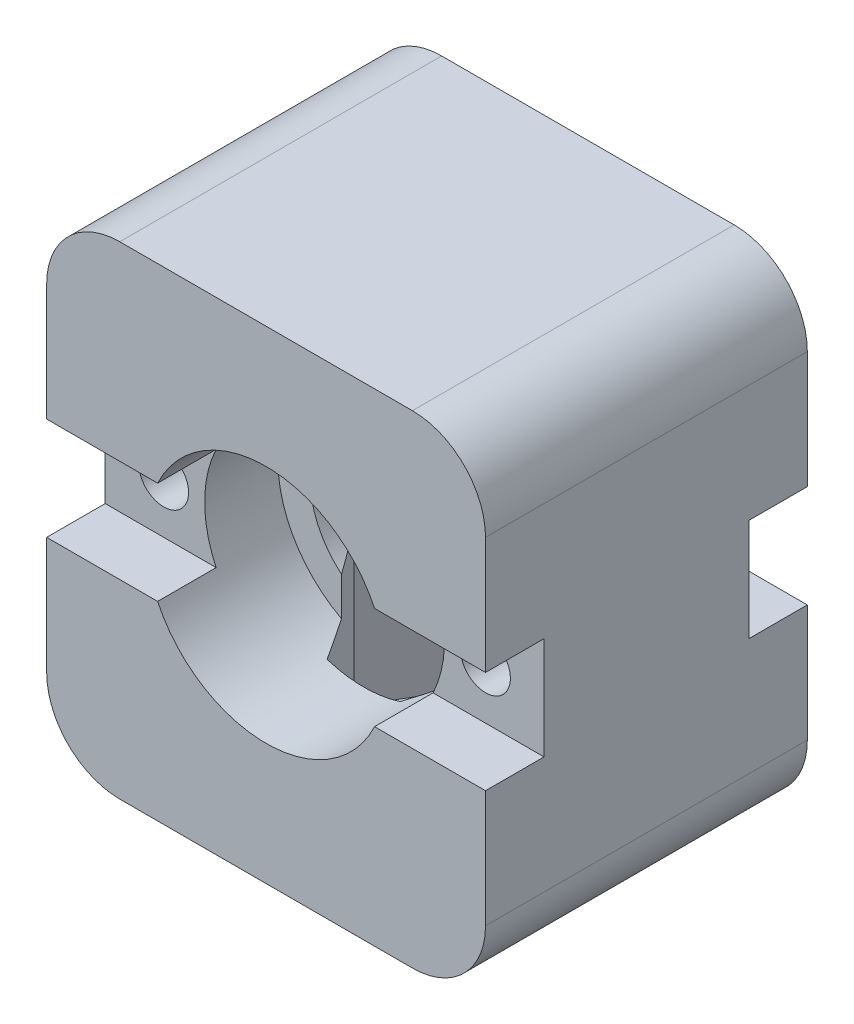
ISO-10303-21;
HEADER;
FILE_DESCRIPTION(('STEP AP214'),'2;1');
FILE_NAME('part.step','',(''),(''),'','','');
FILE_SCHEMA(('AUTOMOTIVE_DESIGN { 1 0 10303 214 1 1 1 1 }'));
ENDSEC;
DATA;
#1=APPLICATION_CONTEXT('core data for automotive mechanical design processes');
#2=APPLICATION_PROTOCOL_DEFINITION('international standard','automotive_design',2000,#1);
#3=PRODUCT_CONTEXT('',#1,'mechanical');
#4=PRODUCT('Part','Part','',(#3));
#5=PRODUCT_RELATED_PRODUCT_CATEGORY('part','',(#4));
#6=PRODUCT_DEFINITION_FORMATION('','',#4);
#7=PRODUCT_DEFINITION_CONTEXT('part definition',#1,'design');
#8=PRODUCT_DEFINITION('design','',#6,#7);
#9=PRODUCT_DEFINITION_SHAPE('','',#8);
#10=(LENGTH_UNIT() NAMED_UNIT(*) SI_UNIT(.MILLI.,.METRE.));
#11=(NAMED_UNIT(*) PLANE_ANGLE_UNIT() SI_UNIT($,.RADIAN.));
#12=(NAMED_UNIT(*) SI_UNIT($,.STERADIAN.) SOLID_ANGLE_UNIT());
#13=UNCERTAINTY_MEASURE_WITH_UNIT(LENGTH_MEASURE(1.E-05),#10,'distance_accuracy_value','');
#14=(GEOMETRIC_REPRESENTATION_CONTEXT(3) GLOBAL_UNCERTAINTY_ASSIGNED_CONTEXT((#13)) GLOBAL_UNIT_ASSIGNED_CONTEXT((#10,
#11,#12)) REPRESENTATION_CONTEXT('',''));
#15=CARTESIAN_POINT('',(0.,0.,0.));
#16=DIRECTION('',(0.,0.,1.));
#17=DIRECTION('',(1.,0.,0.));
#18=AXIS2_PLACEMENT_3D('',#15,#16,#17);
#19=CARTESIAN_POINT('',(11.,0.,22.));
#20=DIRECTION('',(0.,0.,-1.));
#21=DIRECTION('',(-1.,0.,0.));
#22=AXIS2_PLACEMENT_3D('',#19,#20,#21);
#23=CYLINDRICAL_SURFACE('',#22,1.7);
#24=CARTESIAN_POINT('',(11.,0.,7.));
#25=DIRECTION('',(0.,0.,1.));
#26=DIRECTION('',(1.,0.,0.));
#27=AXIS2_PLACEMENT_3D('',#24,#25,#26);
#28=CIRCLE('',#27,1.7);
#29=CARTESIAN_POINT('',(12.7,0.,7.));
#30=VERTEX_POINT('',#29);
#31=EDGE_CURVE('E571',#30,#30,#28,.F.);
#32=ORIENTED_EDGE('',*,*,#31,.F.);
#33=EDGE_LOOP('',(#32));
#34=FACE_BOUND('',#33,.T.);
#35=CARTESIAN_POINT('',(11.,0.,-7.));
#36=DIRECTION('',(0.,0.,-1.));
#37=DIRECTION('',(-1.,0.,0.));
#38=AXIS2_PLACEMENT_3D('',#35,#36,#37);
#39=CIRCLE('',#38,1.7);
#40=CARTESIAN_POINT('',(9.3,0.,-7.));
#41=VERTEX_POINT('',#40);
#42=EDGE_CURVE('E287',#41,#41,#39,.F.);
#43=ORIENTED_EDGE('',*,*,#42,.F.);
#44=EDGE_LOOP('',(#43));
#45=FACE_BOUND('',#44,.T.);
#46=ADVANCED_FACE('F40',(#34,#45),#23,.F.);
#47=CARTESIAN_POINT('',(-11.,0.,22.));
#48=DIRECTION('',(0.,0.,-1.));
#49=DIRECTION('',(-1.,0.,0.));
#50=AXIS2_PLACEMENT_3D('',#47,#48,#49);
#51=CYLINDRICAL_SURFACE('',#50,1.7);
#52=CARTESIAN_POINT('',(-11.,0.,7.));
#53=DIRECTION('',(0.,0.,1.));
#54=DIRECTION('',(1.,0.,0.));
#55=AXIS2_PLACEMENT_3D('',#52,#53,#54);
#56=CIRCLE('',#55,1.7);
#57=CARTESIAN_POINT('',(-9.3,0.,7.));
#58=VERTEX_POINT('',#57);
#59=EDGE_CURVE('E567',#58,#58,#56,.F.);
#60=ORIENTED_EDGE('',*,*,#59,.F.);
#61=EDGE_LOOP('',(#60));
#62=FACE_BOUND('',#61,.T.);
#63=CARTESIAN_POINT('',(-11.,0.,-7.));
#64=DIRECTION('',(0.,0.,-1.));
#65=DIRECTION('',(-1.,0.,0.));
#66=AXIS2_PLACEMENT_3D('',#63,#64,#65);
#67=CIRCLE('',#66,1.7);
#68=CARTESIAN_POINT('',(-12.7,0.,-7.));
#69=VERTEX_POINT('',#68);
#70=EDGE_CURVE('E448',#69,#69,#67,.F.);
#71=ORIENTED_EDGE('',*,*,#70,.F.);
#72=EDGE_LOOP('',(#71));
#73=FACE_BOUND('',#72,.T.);
#74=ADVANCED_FACE('F848',(#62,#73),#51,.F.);
#75=CARTESIAN_POINT('',(-15.,-11.5,-11.));
#76=DIRECTION('',(-1.,0.,0.));
#77=DIRECTION('',(0.,0.,1.));
#78=AXIS2_PLACEMENT_3D('',#75,#76,#77);
#79=PLANE('',#78);
#80=DIRECTION('',(0.,-1.,0.));
#81=VECTOR('',#80,1.);
#82=CARTESIAN_POINT('',(-15.,-11.5,-7.));
#83=LINE('',#82,#81);
#84=CARTESIAN_POINT('',(-15.,3.5,-7.));
#85=VERTEX_POINT('',#84);
#86=CARTESIAN_POINT('',(-15.,-3.5,-7.));
#87=VERTEX_POINT('',#86);
#88=EDGE_CURVE('E444',#85,#87,#83,.T.);
#89=ORIENTED_EDGE('',*,*,#88,.T.);
#90=DIRECTION('',(0.,0.,-1.));
#91=VECTOR('',#90,1.);
#92=CARTESIAN_POINT('',(-15.,-3.5,-11.));
#93=LINE('',#92,#91);
#94=CARTESIAN_POINT('',(-15.,-3.5,-11.));
#95=VERTEX_POINT('',#94);
#96=EDGE_CURVE('E461',#87,#95,#93,.T.);
#97=ORIENTED_EDGE('',*,*,#96,.T.);
#98=DIRECTION('',(0.,-1.,0.));
#99=VECTOR('',#98,1.);
#100=CARTESIAN_POINT('',(-15.,1.5,-11.));
#101=LINE('',#100,#99);
#102=CARTESIAN_POINT('',(-15.,-11.5,-11.));
#103=VERTEX_POINT('',#102);
#104=EDGE_CURVE('E317',#95,#103,#101,.T.);
#105=ORIENTED_EDGE('',*,*,#104,.T.);
#106=DIRECTION('',(0.,0.,1.));
#107=VECTOR('',#106,1.);
#108=CARTESIAN_POINT('',(-15.,-11.5,-11.));
#109=LINE('',#108,#107);
#110=CARTESIAN_POINT('',(-15.,-11.5,11.));
#111=VERTEX_POINT('',#110);
#112=EDGE_CURVE('E323',#103,#111,#109,.T.);
#113=ORIENTED_EDGE('',*,*,#112,.T.);
#114=DIRECTION('',(0.,-1.,0.));
#115=VECTOR('',#114,1.);
#116=CARTESIAN_POINT('',(-15.,1.5,11.));
#117=LINE('',#116,#115);
#118=CARTESIAN_POINT('',(-15.,-3.5,11.));
#119=VERTEX_POINT('',#118);
#120=EDGE_CURVE('E631',#119,#111,#117,.T.);
#121=ORIENTED_EDGE('',*,*,#120,.F.);
#122=DIRECTION('',(0.,0.,1.));
#123=VECTOR('',#122,1.);
#124=CARTESIAN_POINT('',(-15.,-3.5,-11.));
#125=LINE('',#124,#123);
#126=CARTESIAN_POINT('',(-15.,-3.5,7.));
#127=VERTEX_POINT('',#126);
#128=EDGE_CURVE('E586',#127,#119,#125,.T.);
#129=ORIENTED_EDGE('',*,*,#128,.F.);
#130=DIRECTION('',(0.,1.,0.));
#131=VECTOR('',#130,1.);
#132=CARTESIAN_POINT('',(-15.,-11.5,7.));
#133=LINE('',#132,#131);
#134=CARTESIAN_POINT('',(-15.,3.5,7.));
#135=VERTEX_POINT('',#134);
#136=EDGE_CURVE('E579',#127,#135,#133,.T.);
#137=ORIENTED_EDGE('',*,*,#136,.T.);
#138=DIRECTION('',(0.,0.,-1.));
#139=VECTOR('',#138,1.);
#140=CARTESIAN_POINT('',(-15.,3.5,-11.));
#141=LINE('',#140,#139);
#142=CARTESIAN_POINT('',(-15.,3.5,11.));
#143=VERTEX_POINT('',#142);
#144=EDGE_CURVE('E592',#143,#135,#141,.T.);
#145=ORIENTED_EDGE('',*,*,#144,.F.);
#146=CARTESIAN_POINT('',(-15.,11.5,11.));
#147=VERTEX_POINT('',#146);
#148=EDGE_CURVE('E632',#147,#143,#117,.T.);
#149=ORIENTED_EDGE('',*,*,#148,.F.);
#150=DIRECTION('',(0.,0.,1.));
#151=VECTOR('',#150,1.);
#152=CARTESIAN_POINT('',(-15.,11.5,-11.));
#153=LINE('',#152,#151);
#154=CARTESIAN_POINT('',(-15.,11.5,-11.));
#155=VERTEX_POINT('',#154);
#156=EDGE_CURVE('E328',#155,#147,#153,.T.);
#157=ORIENTED_EDGE('',*,*,#156,.F.);
#158=CARTESIAN_POINT('',(-15.,3.5,-11.));
#159=VERTEX_POINT('',#158);
#160=EDGE_CURVE('E318',#155,#159,#101,.T.);
#161=ORIENTED_EDGE('',*,*,#160,.T.);
#162=DIRECTION('',(0.,0.,1.));
#163=VECTOR('',#162,1.);
#164=CARTESIAN_POINT('',(-15.,3.5,-11.));
#165=LINE('',#164,#163);
#166=EDGE_CURVE('E286',#159,#85,#165,.T.);
#167=ORIENTED_EDGE('',*,*,#166,.T.);
#168=EDGE_LOOP('',(#89,#97,#105,#113,#121,#129,#137,#145,#149,#157,#161,#167));
#169=FACE_BOUND('',#168,.T.);
#170=ADVANCED_FACE('F657',(#169),#79,.T.);
#171=CARTESIAN_POINT('',(15.,1.50000000000001,-11.));
#172=DIRECTION('',(1.,0.,0.));
#173=DIRECTION('',(0.,1.,0.));
#174=AXIS2_PLACEMENT_3D('',#171,#172,#173);
#175=PLANE('',#174);
#176=DIRECTION('',(0.,1.,0.));
#177=VECTOR('',#176,1.);
#178=CARTESIAN_POINT('',(15.,-11.5,-11.));
#179=LINE('',#178,#177);
#180=CARTESIAN_POINT('',(15.,-11.5,-11.));
#181=VERTEX_POINT('',#180);
#182=CARTESIAN_POINT('',(15.,-3.5,-11.));
#183=VERTEX_POINT('',#182);
#184=EDGE_CURVE('E296',#181,#183,#179,.T.);
#185=ORIENTED_EDGE('',*,*,#184,.T.);
#186=DIRECTION('',(0.,0.,1.));
#187=VECTOR('',#186,1.);
#188=CARTESIAN_POINT('',(15.,-3.5,-11.));
#189=LINE('',#188,#187);
#190=CARTESIAN_POINT('',(15.,-3.5,-7.));
#191=VERTEX_POINT('',#190);
#192=EDGE_CURVE('E458',#183,#191,#189,.T.);
#193=ORIENTED_EDGE('',*,*,#192,.T.);
#194=DIRECTION('',(0.,1.,0.));
#195=VECTOR('',#194,1.);
#196=CARTESIAN_POINT('',(15.,1.50000000000001,-7.));
#197=LINE('',#196,#195);
#198=CARTESIAN_POINT('',(15.,3.5,-7.));
#199=VERTEX_POINT('',#198);
#200=EDGE_CURVE('E284',#191,#199,#197,.T.);
#201=ORIENTED_EDGE('',*,*,#200,.T.);
#202=DIRECTION('',(0.,0.,-1.));
#203=VECTOR('',#202,1.);
#204=CARTESIAN_POINT('',(15.,3.5,-11.));
#205=LINE('',#204,#203);
#206=CARTESIAN_POINT('',(15.,3.5,-11.));
#207=VERTEX_POINT('',#206);
#208=EDGE_CURVE('E265',#199,#207,#205,.T.);
#209=ORIENTED_EDGE('',*,*,#208,.T.);
#210=CARTESIAN_POINT('',(15.,11.5,-11.));
#211=VERTEX_POINT('',#210);
#212=EDGE_CURVE('E281',#207,#211,#179,.T.);
#213=ORIENTED_EDGE('',*,*,#212,.T.);
#214=DIRECTION('',(0.,0.,1.));
#215=VECTOR('',#214,1.);
#216=CARTESIAN_POINT('',(15.,11.5,-11.));
#217=LINE('',#216,#215);
#218=CARTESIAN_POINT('',(15.,11.5,11.));
#219=VERTEX_POINT('',#218);
#220=EDGE_CURVE('E337',#211,#219,#217,.T.);
#221=ORIENTED_EDGE('',*,*,#220,.T.);
#222=DIRECTION('',(0.,1.,0.));
#223=VECTOR('',#222,1.);
#224=CARTESIAN_POINT('',(15.,-11.5,11.));
#225=LINE('',#224,#223);
#226=CARTESIAN_POINT('',(15.,3.5,11.));
#227=VERTEX_POINT('',#226);
#228=EDGE_CURVE('E614',#227,#219,#225,.T.);
#229=ORIENTED_EDGE('',*,*,#228,.F.);
#230=DIRECTION('',(0.,0.,1.));
#231=VECTOR('',#230,1.);
#232=CARTESIAN_POINT('',(15.,3.5,-11.));
#233=LINE('',#232,#231);
#234=CARTESIAN_POINT('',(15.,3.5,7.));
#235=VERTEX_POINT('',#234);
#236=EDGE_CURVE('E589',#235,#227,#233,.T.);
#237=ORIENTED_EDGE('',*,*,#236,.F.);
#238=DIRECTION('',(0.,-1.,0.));
#239=VECTOR('',#238,1.);
#240=CARTESIAN_POINT('',(15.,1.50000000000001,7.));
#241=LINE('',#240,#239);
#242=CARTESIAN_POINT('',(15.,-3.5,7.));
#243=VERTEX_POINT('',#242);
#244=EDGE_CURVE('E575',#235,#243,#241,.T.);
#245=ORIENTED_EDGE('',*,*,#244,.T.);
#246=DIRECTION('',(0.,0.,-1.));
#247=VECTOR('',#246,1.);
#248=CARTESIAN_POINT('',(15.,-3.5,-11.));
#249=LINE('',#248,#247);
#250=CARTESIAN_POINT('',(15.,-3.5,11.));
#251=VERTEX_POINT('',#250);
#252=EDGE_CURVE('E583',#251,#243,#249,.T.);
#253=ORIENTED_EDGE('',*,*,#252,.F.);
#254=CARTESIAN_POINT('',(15.,-11.5,11.));
#255=VERTEX_POINT('',#254);
#256=EDGE_CURVE('E615',#255,#251,#225,.T.);
#257=ORIENTED_EDGE('',*,*,#256,.F.);
#258=DIRECTION('',(0.,0.,1.));
#259=VECTOR('',#258,1.);
#260=CARTESIAN_POINT('',(15.,-11.5,-11.));
#261=LINE('',#260,#259);
#262=EDGE_CURVE('E340',#181,#255,#261,.T.);
#263=ORIENTED_EDGE('',*,*,#262,.F.);
#264=EDGE_LOOP('',(#185,#193,#201,#209,#213,#221,#229,#237,#245,#253,#257,#263));
#265=FACE_BOUND('',#264,.T.);
#266=ADVANCED_FACE('F279',(#265),#175,.T.);
#267=CARTESIAN_POINT('',(-10.,-11.5,-11.));
#268=DIRECTION('',(0.,0.,1.));
#269=DIRECTION('',(1.,0.,0.));
#270=AXIS2_PLACEMENT_3D('',#267,#268,#269);
#271=PLANE('',#270);
#272=DIRECTION('',(1.,0.,0.));
#273=VECTOR('',#272,1.);
#274=CARTESIAN_POINT('',(15.3,-3.5,-11.));
#275=LINE('',#274,#273);
#276=CARTESIAN_POINT('',(7.41552425658496,-3.5,-11.));
#277=VERTEX_POINT('',#276);
#278=EDGE_CURVE('E273',#277,#183,#275,.T.);
#279=ORIENTED_EDGE('',*,*,#278,.T.);
#280=ORIENTED_EDGE('',*,*,#184,.F.);
#281=CARTESIAN_POINT('',(10.,-11.5,-11.));
#282=DIRECTION('',(0.,0.,1.));
#283=DIRECTION('',(1.,0.,0.));
#284=AXIS2_PLACEMENT_3D('',#281,#282,#283);
#285=CIRCLE('',#284,5.);
#286=CARTESIAN_POINT('',(9.99999999999996,-16.5,-11.));
#287=VERTEX_POINT('',#286);
#288=EDGE_CURVE('E297',#287,#181,#285,.T.);
#289=ORIENTED_EDGE('',*,*,#288,.F.);
#290=DIRECTION('',(1.,0.,0.));
#291=VECTOR('',#290,1.);
#292=CARTESIAN_POINT('',(9.99999999999996,-16.5,-11.));
#293=LINE('',#292,#291);
#294=CARTESIAN_POINT('',(-9.99999999999996,-16.5,-11.));
#295=VERTEX_POINT('',#294);
#296=EDGE_CURVE('E303',#295,#287,#293,.T.);
#297=ORIENTED_EDGE('',*,*,#296,.F.);
#298=CARTESIAN_POINT('',(-10.,-11.5,-11.));
#299=DIRECTION('',(0.,0.,1.));
#300=DIRECTION('',(1.,0.,0.));
#301=AXIS2_PLACEMENT_3D('',#298,#299,#300);
#302=CIRCLE('',#301,5.);
#303=EDGE_CURVE('E636',#103,#295,#302,.T.);
#304=ORIENTED_EDGE('',*,*,#303,.F.);
#305=ORIENTED_EDGE('',*,*,#104,.F.);
#306=CARTESIAN_POINT('',(-7.41552425658496,-3.5,-11.));
#307=VERTEX_POINT('',#306);
#308=EDGE_CURVE('E436',#95,#307,#275,.T.);
#309=ORIENTED_EDGE('',*,*,#308,.T.);
#310=CARTESIAN_POINT('',(0.,0.,-11.));
#311=DIRECTION('',(0.,0.,1.));
#312=DIRECTION('',(1.,0.,0.));
#313=AXIS2_PLACEMENT_3D('',#310,#311,#312);
#314=CIRCLE('',#313,8.2);
#315=EDGE_CURVE('E465',#307,#277,#314,.T.);
#316=ORIENTED_EDGE('',*,*,#315,.T.);
#317=EDGE_LOOP('',(#279,#280,#289,#297,#304,#305,#309,#316));
#318=FACE_BOUND('',#317,.T.);
#319=ADVANCED_FACE('F649',(#318),#271,.F.);
#320=DIRECTION('',(-1.,0.,0.));
#321=VECTOR('',#320,1.);
#322=CARTESIAN_POINT('',(15.3,3.5,-11.));
#323=LINE('',#322,#321);
#324=CARTESIAN_POINT('',(-7.41552425658496,3.5,-11.));
#325=VERTEX_POINT('',#324);
#326=EDGE_CURVE('E274',#325,#159,#323,.T.);
#327=ORIENTED_EDGE('',*,*,#326,.T.);
#328=ORIENTED_EDGE('',*,*,#160,.F.);
#329=CARTESIAN_POINT('',(-10.,11.5,-11.));
#330=DIRECTION('',(0.,0.,1.));
#331=DIRECTION('',(-1.,0.,0.));
#332=AXIS2_PLACEMENT_3D('',#329,#330,#331);
#333=CIRCLE('',#332,5.);
#334=CARTESIAN_POINT('',(-9.99999999999996,16.5,-11.));
#335=VERTEX_POINT('',#334);
#336=EDGE_CURVE('E313',#335,#155,#333,.T.);
#337=ORIENTED_EDGE('',*,*,#336,.F.);
#338=DIRECTION('',(-1.,0.,0.));
#339=VECTOR('',#338,1.);
#340=CARTESIAN_POINT('',(9.99999999999996,16.5,-11.));
#341=LINE('',#340,#339);
#342=CARTESIAN_POINT('',(9.99999999999996,16.5,-11.));
#343=VERTEX_POINT('',#342);
#344=EDGE_CURVE('E309',#343,#335,#341,.T.);
#345=ORIENTED_EDGE('',*,*,#344,.F.);
#346=CARTESIAN_POINT('',(10.,11.5,-11.));
#347=DIRECTION('',(0.,0.,1.));
#348=DIRECTION('',(1.,0.,0.));
#349=AXIS2_PLACEMENT_3D('',#346,#347,#348);
#350=CIRCLE('',#349,5.);
#351=EDGE_CURVE('E294',#211,#343,#350,.T.);
#352=ORIENTED_EDGE('',*,*,#351,.F.);
#353=ORIENTED_EDGE('',*,*,#212,.F.);
#354=CARTESIAN_POINT('',(7.41552425658496,3.5,-11.));
#355=VERTEX_POINT('',#354);
#356=EDGE_CURVE('E261',#207,#355,#323,.T.);
#357=ORIENTED_EDGE('',*,*,#356,.T.);
#358=EDGE_CURVE('E471',#355,#325,#314,.T.);
#359=ORIENTED_EDGE('',*,*,#358,.T.);
#360=EDGE_LOOP('',(#327,#328,#337,#345,#352,#353,#357,#359));
#361=FACE_BOUND('',#360,.T.);
#362=ADVANCED_FACE('F291',(#361),#271,.F.);
#363=CARTESIAN_POINT('',(0.,0.,-2.));
#364=DIRECTION('',(0.,0.,-1.));
#365=DIRECTION('',(-1.,0.,0.));
#366=AXIS2_PLACEMENT_3D('',#363,#364,#365);
#367=CYLINDRICAL_SURFACE('',#366,8.2);
#368=CARTESIAN_POINT('',(0.,0.,-8.66025403784439));
#369=DIRECTION('',(-0.866025403784439,0.,-0.5));
#370=DIRECTION('',(0.5,0.,-0.866025403784439));
#371=AXIS2_PLACEMENT_3D('',#368,#369,#370);
#372=ELLIPSE('',#371,16.4,8.2);
#373=CARTESIAN_POINT('',(-3.84529946162075,-7.24249073526913,-2.));
#374=VERTEX_POINT('',#373);
#375=CARTESIAN_POINT('',(-2.5,-7.80960946526777,-4.3301270189222));
#376=VERTEX_POINT('',#375);
#377=EDGE_CURVE('E482',#374,#376,#372,.F.);
#378=ORIENTED_EDGE('',*,*,#377,.T.);
#379=CARTESIAN_POINT('',(0.,0.,-4.3301270189222));
#380=DIRECTION('',(0.,0.,-1.));
#381=DIRECTION('',(-1.,0.,0.));
#382=AXIS2_PLACEMENT_3D('',#379,#380,#381);
#383=CIRCLE('',#382,8.2);
#384=CARTESIAN_POINT('',(2.5,-7.80960946526778,-4.3301270189222));
#385=VERTEX_POINT('',#384);
#386=EDGE_CURVE('E479',#376,#385,#383,.F.);
#387=ORIENTED_EDGE('',*,*,#386,.T.);
#388=CARTESIAN_POINT('',(0.,0.,-8.66025403784439));
#389=DIRECTION('',(0.866025403784439,0.,-0.5));
#390=DIRECTION('',(-0.5,0.,-0.866025403784439));
#391=AXIS2_PLACEMENT_3D('',#388,#389,#390);
#392=ELLIPSE('',#391,16.4,8.2);
#393=CARTESIAN_POINT('',(3.84529946162075,-7.24249073526913,-2.));
#394=VERTEX_POINT('',#393);
#395=EDGE_CURVE('E401',#385,#394,#392,.F.);
#396=ORIENTED_EDGE('',*,*,#395,.T.);
#397=CARTESIAN_POINT('',(0.,0.,-2.));
#398=DIRECTION('',(0.,0.,1.));
#399=DIRECTION('',(1.,0.,0.));
#400=AXIS2_PLACEMENT_3D('',#397,#398,#399);
#401=CIRCLE('',#400,8.2);
#402=EDGE_CURVE('E466',#394,#374,#401,.T.);
#403=ORIENTED_EDGE('',*,*,#402,.T.);
#404=EDGE_LOOP('',(#378,#387,#396,#403));
#405=FACE_BOUND('',#404,.T.);
#406=CARTESIAN_POINT('',(0.,0.,-7.));
#407=DIRECTION('',(0.,0.,-1.));
#408=DIRECTION('',(-1.,0.,0.));
#409=AXIS2_PLACEMENT_3D('',#406,#407,#408);
#410=CIRCLE('',#409,8.2);
#411=CARTESIAN_POINT('',(7.41552425658496,3.5,-7.));
#412=VERTEX_POINT('',#411);
#413=CARTESIAN_POINT('',(7.41552425658496,-3.5,-7.));
#414=VERTEX_POINT('',#413);
#415=EDGE_CURVE('E410',#412,#414,#410,.T.);
#416=ORIENTED_EDGE('',*,*,#415,.T.);
#417=DIRECTION('',(0.,0.,-1.));
#418=VECTOR('',#417,1.);
#419=CARTESIAN_POINT('',(7.41552425658496,-3.5,-2.));
#420=LINE('',#419,#418);
#421=EDGE_CURVE('E11',#414,#277,#420,.T.);
#422=ORIENTED_EDGE('',*,*,#421,.T.);
#423=ORIENTED_EDGE('',*,*,#315,.F.);
#424=DIRECTION('',(0.,0.,-1.));
#425=VECTOR('',#424,1.);
#426=CARTESIAN_POINT('',(-7.41552425658496,-3.5,-2.));
#427=LINE('',#426,#425);
#428=CARTESIAN_POINT('',(-7.41552425658496,-3.5,-7.));
#429=VERTEX_POINT('',#428);
#430=EDGE_CURVE('E414',#307,#429,#427,.F.);
#431=ORIENTED_EDGE('',*,*,#430,.T.);
#432=CARTESIAN_POINT('',(-7.41552425658496,3.5,-7.));
#433=VERTEX_POINT('',#432);
#434=EDGE_CURVE('E405',#429,#433,#410,.T.);
#435=ORIENTED_EDGE('',*,*,#434,.T.);
#436=DIRECTION('',(0.,0.,-1.));
#437=VECTOR('',#436,1.);
#438=CARTESIAN_POINT('',(-7.41552425658496,3.5,-2.));
#439=LINE('',#438,#437);
#440=EDGE_CURVE('E409',#433,#325,#439,.T.);
#441=ORIENTED_EDGE('',*,*,#440,.T.);
#442=ORIENTED_EDGE('',*,*,#358,.F.);
#443=DIRECTION('',(0.,0.,-1.));
#444=VECTOR('',#443,1.);
#445=CARTESIAN_POINT('',(7.41552425658496,3.5,-2.));
#446=LINE('',#445,#444);
#447=EDGE_CURVE('E49',#355,#412,#446,.F.);
#448=ORIENTED_EDGE('',*,*,#447,.T.);
#449=EDGE_LOOP('',(#416,#422,#423,#431,#435,#441,#442,#448));
#450=FACE_BOUND('',#449,.T.);
#451=ADVANCED_FACE('F423',(#405,#450),#367,.F.);
#452=CARTESIAN_POINT('',(0.,0.,22.));
#453=DIRECTION('',(0.,0.,-1.));
#454=DIRECTION('',(-1.,0.,0.));
#455=AXIS2_PLACEMENT_3D('',#452,#453,#454);
#456=CYLINDRICAL_SURFACE('',#455,6.);
#457=CARTESIAN_POINT('',(0.,0.,-2.));
#458=DIRECTION('',(0.,0.,-1.));
#459=DIRECTION('',(-1.,0.,0.));
#460=AXIS2_PLACEMENT_3D('',#457,#458,#459);
#461=CIRCLE('',#460,6.);
#462=CARTESIAN_POINT('',(3.84529946162075,-4.60583022379888,-2.));
#463=VERTEX_POINT('',#462);
#464=CARTESIAN_POINT('',(-3.84529946162075,-4.60583022379887,-2.));
#465=VERTEX_POINT('',#464);
#466=EDGE_CURVE('E470',#463,#465,#461,.F.);
#467=ORIENTED_EDGE('',*,*,#466,.F.);
#468=CARTESIAN_POINT('',(0.,0.,-8.66025403784438));
#469=DIRECTION('',(0.866025403784439,0.,-0.5));
#470=DIRECTION('',(-0.5,0.,-0.866025403784439));
#471=AXIS2_PLACEMENT_3D('',#468,#469,#470);
#472=ELLIPSE('',#471,12.,6.);
#473=CARTESIAN_POINT('',(5.,-3.31662479035541,0.));
#474=VERTEX_POINT('',#473);
#475=EDGE_CURVE('E385',#463,#474,#472,.F.);
#476=ORIENTED_EDGE('',*,*,#475,.T.);
#477=CARTESIAN_POINT('',(0.,0.,8.66025403784439));
#478=DIRECTION('',(0.866025403784439,0.,0.5));
#479=DIRECTION('',(0.5,0.,-0.866025403784439));
#480=AXIS2_PLACEMENT_3D('',#477,#478,#479);
#481=ELLIPSE('',#480,12.,6.);
#482=CARTESIAN_POINT('',(3.84529946162075,-4.60583022379887,2.));
#483=VERTEX_POINT('',#482);
#484=EDGE_CURVE('E545',#474,#483,#481,.F.);
#485=ORIENTED_EDGE('',*,*,#484,.T.);
#486=CARTESIAN_POINT('',(0.,0.,2.));
#487=DIRECTION('',(0.,0.,1.));
#488=DIRECTION('',(1.,0.,0.));
#489=AXIS2_PLACEMENT_3D('',#486,#487,#488);
#490=CIRCLE('',#489,6.);
#491=CARTESIAN_POINT('',(-3.84529946162075,-4.60583022379887,2.));
#492=VERTEX_POINT('',#491);
#493=EDGE_CURVE('E348',#492,#483,#490,.F.);
#494=ORIENTED_EDGE('',*,*,#493,.F.);
#495=CARTESIAN_POINT('',(0.,0.,8.6602540378444));
#496=DIRECTION('',(-0.866025403784439,0.,0.5));
#497=DIRECTION('',(-0.5,0.,-0.866025403784439));
#498=AXIS2_PLACEMENT_3D('',#495,#496,#497);
#499=ELLIPSE('',#498,12.,6.);
#500=CARTESIAN_POINT('',(-5.,-3.31662479035539,0.));
#501=VERTEX_POINT('',#500);
#502=EDGE_CURVE('E538',#492,#501,#499,.F.);
#503=ORIENTED_EDGE('',*,*,#502,.T.);
#504=CARTESIAN_POINT('',(0.,0.,-8.6602540378444));
#505=DIRECTION('',(-0.866025403784439,0.,-0.5));
#506=DIRECTION('',(0.5,0.,-0.866025403784439));
#507=AXIS2_PLACEMENT_3D('',#504,#505,#506);
#508=ELLIPSE('',#507,12.,6.);
#509=EDGE_CURVE('E388',#501,#465,#508,.F.);
#510=ORIENTED_EDGE('',*,*,#509,.T.);
#511=EDGE_LOOP('',(#467,#476,#485,#494,#503,#510));
#512=FACE_BOUND('',#511,.T.);
#513=ADVANCED_FACE('F861',(#512),#456,.F.);
#514=CARTESIAN_POINT('',(-2.5,-14.,-4.3301270189222));
#515=DIRECTION('',(-0.866025403784439,0.,-0.5));
#516=DIRECTION('',(-0.5,0.,0.866025403784439));
#517=AXIS2_PLACEMENT_3D('',#514,#515,#516);
#518=PLANE('',#517);
#519=ORIENTED_EDGE('',*,*,#377,.F.);
#520=DIRECTION('',(0.,-1.,0.));
#521=VECTOR('',#520,1.);
#522=CARTESIAN_POINT('',(-3.84529946162075,-14.,-2.));
#523=LINE('',#522,#521);
#524=EDGE_CURVE('E476',#465,#374,#523,.T.);
#525=ORIENTED_EDGE('',*,*,#524,.F.);
#526=ORIENTED_EDGE('',*,*,#509,.F.);
#527=DIRECTION('',(0.,1.,0.));
#528=VECTOR('',#527,1.);
#529=CARTESIAN_POINT('',(-5.,-14.,0.));
#530=LINE('',#529,#528);
#531=CARTESIAN_POINT('',(-5.,-14.,0.));
#532=VERTEX_POINT('',#531);
#533=EDGE_CURVE('E521',#532,#501,#530,.T.);
#534=ORIENTED_EDGE('',*,*,#533,.F.);
#535=DIRECTION('',(-0.5,0.,0.866025403784439));
#536=VECTOR('',#535,1.);
#537=CARTESIAN_POINT('',(-2.5,-14.,-4.3301270189222));
#538=LINE('',#537,#536);
#539=CARTESIAN_POINT('',(-2.5,-14.,-4.3301270189222));
#540=VERTEX_POINT('',#539);
#541=EDGE_CURVE('E499',#540,#532,#538,.T.);
#542=ORIENTED_EDGE('',*,*,#541,.F.);
#543=DIRECTION('',(0.,1.,0.));
#544=VECTOR('',#543,1.);
#545=CARTESIAN_POINT('',(-2.5,-14.,-4.3301270189222));
#546=LINE('',#545,#544);
#547=EDGE_CURVE('E525',#540,#376,#546,.T.);
#548=ORIENTED_EDGE('',*,*,#547,.T.);
#549=EDGE_LOOP('',(#519,#525,#526,#534,#542,#548));
#550=FACE_BOUND('',#549,.T.);
#551=ADVANCED_FACE('F864',(#550),#518,.F.);
#552=CARTESIAN_POINT('',(5.,-14.,0.));
#553=DIRECTION('',(0.866025403784439,0.,-0.5));
#554=DIRECTION('',(-0.5,0.,-0.866025403784439));
#555=AXIS2_PLACEMENT_3D('',#552,#553,#554);
#556=PLANE('',#555);
#557=ORIENTED_EDGE('',*,*,#395,.F.);
#558=DIRECTION('',(0.,1.,0.));
#559=VECTOR('',#558,1.);
#560=CARTESIAN_POINT('',(2.5,-14.,-4.3301270189222));
#561=LINE('',#560,#559);
#562=CARTESIAN_POINT('',(2.5,-14.,-4.3301270189222));
#563=VERTEX_POINT('',#562);
#564=EDGE_CURVE('E529',#563,#385,#561,.T.);
#565=ORIENTED_EDGE('',*,*,#564,.F.);
#566=DIRECTION('',(-0.5,0.,-0.866025403784439));
#567=VECTOR('',#566,1.);
#568=CARTESIAN_POINT('',(5.,-14.,0.));
#569=LINE('',#568,#567);
#570=CARTESIAN_POINT('',(5.,-14.,0.));
#571=VERTEX_POINT('',#570);
#572=EDGE_CURVE('E491',#571,#563,#569,.T.);
#573=ORIENTED_EDGE('',*,*,#572,.F.);
#574=DIRECTION('',(0.,1.,0.));
#575=VECTOR('',#574,1.);
#576=CARTESIAN_POINT('',(5.,-14.,0.));
#577=LINE('',#576,#575);
#578=EDGE_CURVE('E511',#571,#474,#577,.T.);
#579=ORIENTED_EDGE('',*,*,#578,.T.);
#580=ORIENTED_EDGE('',*,*,#475,.F.);
#581=DIRECTION('',(0.,1.,0.));
#582=VECTOR('',#581,1.);
#583=CARTESIAN_POINT('',(3.84529946162075,-14.,-2.));
#584=LINE('',#583,#582);
#585=EDGE_CURVE('E392',#394,#463,#584,.T.);
#586=ORIENTED_EDGE('',*,*,#585,.F.);
#587=EDGE_LOOP('',(#557,#565,#573,#579,#580,#586));
#588=FACE_BOUND('',#587,.T.);
#589=ADVANCED_FACE('F914',(#588),#556,.F.);
#590=CARTESIAN_POINT('',(-10.,-11.5,11.));
#591=DIRECTION('',(0.,0.,1.));
#592=DIRECTION('',(1.,0.,0.));
#593=AXIS2_PLACEMENT_3D('',#590,#591,#592);
#594=PLANE('',#593);
#595=DIRECTION('',(-1.,0.,0.));
#596=VECTOR('',#595,1.);
#597=CARTESIAN_POINT('',(15.3,3.5,11.));
#598=LINE('',#597,#596);
#599=CARTESIAN_POINT('',(7.41552425658496,3.5,11.));
#600=VERTEX_POINT('',#599);
#601=EDGE_CURVE('E555',#227,#600,#598,.T.);
#602=ORIENTED_EDGE('',*,*,#601,.F.);
#603=ORIENTED_EDGE('',*,*,#228,.T.);
#604=CARTESIAN_POINT('',(10.,11.5,11.));
#605=DIRECTION('',(0.,0.,1.));
#606=DIRECTION('',(1.,0.,0.));
#607=AXIS2_PLACEMENT_3D('',#604,#605,#606);
#608=CIRCLE('',#607,5.);
#609=CARTESIAN_POINT('',(9.99999999999996,16.5,11.));
#610=VERTEX_POINT('',#609);
#611=EDGE_CURVE('E619',#219,#610,#608,.T.);
#612=ORIENTED_EDGE('',*,*,#611,.T.);
#613=DIRECTION('',(-1.,0.,0.));
#614=VECTOR('',#613,1.);
#615=CARTESIAN_POINT('',(9.99999999999996,16.5,11.));
#616=LINE('',#615,#614);
#617=CARTESIAN_POINT('',(-9.99999999999996,16.5,11.));
#618=VERTEX_POINT('',#617);
#619=EDGE_CURVE('E623',#610,#618,#616,.T.);
#620=ORIENTED_EDGE('',*,*,#619,.T.);
#621=CARTESIAN_POINT('',(-10.,11.5,11.));
#622=DIRECTION('',(0.,0.,1.));
#623=DIRECTION('',(-1.,0.,0.));
#624=AXIS2_PLACEMENT_3D('',#621,#622,#623);
#625=CIRCLE('',#624,5.);
#626=EDGE_CURVE('E627',#618,#147,#625,.T.);
#627=ORIENTED_EDGE('',*,*,#626,.T.);
#628=ORIENTED_EDGE('',*,*,#148,.T.);
#629=CARTESIAN_POINT('',(-7.41552425658496,3.5,11.));
#630=VERTEX_POINT('',#629);
#631=EDGE_CURVE('E564',#630,#143,#598,.T.);
#632=ORIENTED_EDGE('',*,*,#631,.F.);
#633=CARTESIAN_POINT('',(0.,0.,11.));
#634=DIRECTION('',(0.,0.,1.));
#635=DIRECTION('',(1.,0.,0.));
#636=AXIS2_PLACEMENT_3D('',#633,#634,#635);
#637=CIRCLE('',#636,8.2);
#638=EDGE_CURVE('E599',#600,#630,#637,.T.);
#639=ORIENTED_EDGE('',*,*,#638,.F.);
#640=EDGE_LOOP('',(#602,#603,#612,#620,#627,#628,#632,#639));
#641=FACE_BOUND('',#640,.T.);
#642=ADVANCED_FACE('F711',(#641),#594,.T.);
#643=CARTESIAN_POINT('',(-10.,-11.5,-11.));
#644=DIRECTION('',(0.,0.,1.));
#645=DIRECTION('',(1.,0.,0.));
#646=AXIS2_PLACEMENT_3D('',#643,#644,#645);
#647=CYLINDRICAL_SURFACE('',#646,5.);
#648=DIRECTION('',(0.,0.,1.));
#649=VECTOR('',#648,1.);
#650=CARTESIAN_POINT('',(-9.99999999999996,-16.5,-11.));
#651=LINE('',#650,#649);
#652=CARTESIAN_POINT('',(-9.99999999999996,-16.5,11.));
#653=VERTEX_POINT('',#652);
#654=EDGE_CURVE('E322',#295,#653,#651,.T.);
#655=ORIENTED_EDGE('',*,*,#654,.T.);
#656=CARTESIAN_POINT('',(-10.,-11.5,11.));
#657=DIRECTION('',(0.,0.,1.));
#658=DIRECTION('',(1.,0.,0.));
#659=AXIS2_PLACEMENT_3D('',#656,#657,#658);
#660=CIRCLE('',#659,5.);
#661=EDGE_CURVE('E352',#111,#653,#660,.T.);
#662=ORIENTED_EDGE('',*,*,#661,.F.);
#663=ORIENTED_EDGE('',*,*,#112,.F.);
#664=ORIENTED_EDGE('',*,*,#303,.T.);
#665=EDGE_LOOP('',(#655,#662,#663,#664));
#666=FACE_BOUND('',#665,.T.);
#667=ADVANCED_FACE('F42',(#666),#647,.T.);
#668=CARTESIAN_POINT('',(-10.,11.5,-11.));
#669=DIRECTION('',(0.,0.,1.));
#670=DIRECTION('',(1.,0.,0.));
#671=AXIS2_PLACEMENT_3D('',#668,#669,#670);
#672=CYLINDRICAL_SURFACE('',#671,5.);
#673=ORIENTED_EDGE('',*,*,#156,.T.);
#674=ORIENTED_EDGE('',*,*,#626,.F.);
#675=DIRECTION('',(0.,0.,1.));
#676=VECTOR('',#675,1.);
#677=CARTESIAN_POINT('',(-9.99999999999996,16.5,-11.));
#678=LINE('',#677,#676);
#679=EDGE_CURVE('E331',#335,#618,#678,.T.);
#680=ORIENTED_EDGE('',*,*,#679,.F.);
#681=ORIENTED_EDGE('',*,*,#336,.T.);
#682=EDGE_LOOP('',(#673,#674,#680,#681));
#683=FACE_BOUND('',#682,.T.);
#684=ADVANCED_FACE('F830',(#683),#672,.T.);
#685=CARTESIAN_POINT('',(9.99999999999996,16.5,-11.));
#686=DIRECTION('',(0.,1.,0.));
#687=DIRECTION('',(0.,0.,1.));
#688=AXIS2_PLACEMENT_3D('',#685,#686,#687);
#689=PLANE('',#688);
#690=ORIENTED_EDGE('',*,*,#679,.T.);
#691=ORIENTED_EDGE('',*,*,#619,.F.);
#692=DIRECTION('',(0.,0.,1.));
#693=VECTOR('',#692,1.);
#694=CARTESIAN_POINT('',(9.99999999999996,16.5,-11.));
#695=LINE('',#694,#693);
#696=EDGE_CURVE('E334',#343,#610,#695,.T.);
#697=ORIENTED_EDGE('',*,*,#696,.F.);
#698=ORIENTED_EDGE('',*,*,#344,.T.);
#699=EDGE_LOOP('',(#690,#691,#697,#698));
#700=FACE_BOUND('',#699,.T.);
#701=ADVANCED_FACE('F827',(#700),#689,.T.);
#702=CARTESIAN_POINT('',(10.,11.5,-11.));
#703=DIRECTION('',(0.,0.,1.));
#704=DIRECTION('',(1.,0.,0.));
#705=AXIS2_PLACEMENT_3D('',#702,#703,#704);
#706=CYLINDRICAL_SURFACE('',#705,5.);
#707=ORIENTED_EDGE('',*,*,#696,.T.);
#708=ORIENTED_EDGE('',*,*,#611,.F.);
#709=ORIENTED_EDGE('',*,*,#220,.F.);
#710=ORIENTED_EDGE('',*,*,#351,.T.);
#711=EDGE_LOOP('',(#707,#708,#709,#710));
#712=FACE_BOUND('',#711,.T.);
#713=ADVANCED_FACE('F877',(#712),#706,.T.);
#714=CARTESIAN_POINT('',(10.,-11.5,-11.));
#715=DIRECTION('',(0.,0.,1.));
#716=DIRECTION('',(1.,0.,0.));
#717=AXIS2_PLACEMENT_3D('',#714,#715,#716);
#718=CYLINDRICAL_SURFACE('',#717,5.);
#719=ORIENTED_EDGE('',*,*,#262,.T.);
#720=CARTESIAN_POINT('',(10.,-11.5,11.));
#721=DIRECTION('',(0.,0.,1.));
#722=DIRECTION('',(1.,0.,0.));
#723=AXIS2_PLACEMENT_3D('',#720,#721,#722);
#724=CIRCLE('',#723,5.);
#725=CARTESIAN_POINT('',(9.99999999999996,-16.5,11.));
#726=VERTEX_POINT('',#725);
#727=EDGE_CURVE('E610',#726,#255,#724,.T.);
#728=ORIENTED_EDGE('',*,*,#727,.F.);
#729=DIRECTION('',(0.,0.,1.));
#730=VECTOR('',#729,1.);
#731=CARTESIAN_POINT('',(9.99999999999996,-16.5,-11.));
#732=LINE('',#731,#730);
#733=EDGE_CURVE('E343',#287,#726,#732,.T.);
#734=ORIENTED_EDGE('',*,*,#733,.F.);
#735=ORIENTED_EDGE('',*,*,#288,.T.);
#736=EDGE_LOOP('',(#719,#728,#734,#735));
#737=FACE_BOUND('',#736,.T.);
#738=ADVANCED_FACE('F780',(#737),#718,.T.);
#739=CARTESIAN_POINT('',(9.99999999999996,-16.5,-11.));
#740=DIRECTION('',(0.,-1.,0.));
#741=DIRECTION('',(1.,0.,0.));
#742=AXIS2_PLACEMENT_3D('',#739,#740,#741);
#743=PLANE('',#742);
#744=CARTESIAN_POINT('',(0.,-16.5,0.));
#745=DIRECTION('',(0.,-1.,0.));
#746=DIRECTION('',(1.,0.,0.));
#747=AXIS2_PLACEMENT_3D('',#744,#745,#746);
#748=CIRCLE('',#747,2.6);
#749=CARTESIAN_POINT('',(2.6,-16.5,0.));
#750=VERTEX_POINT('',#749);
#751=EDGE_CURVE('E398',#750,#750,#748,.T.);
#752=ORIENTED_EDGE('',*,*,#751,.F.);
#753=EDGE_LOOP('',(#752));
#754=FACE_BOUND('',#753,.T.);
#755=ORIENTED_EDGE('',*,*,#733,.T.);
#756=DIRECTION('',(1.,0.,0.));
#757=VECTOR('',#756,1.);
#758=CARTESIAN_POINT('',(9.99999999999996,-16.5,11.));
#759=LINE('',#758,#757);
#760=EDGE_CURVE('E606',#653,#726,#759,.T.);
#761=ORIENTED_EDGE('',*,*,#760,.F.);
#762=ORIENTED_EDGE('',*,*,#654,.F.);
#763=ORIENTED_EDGE('',*,*,#296,.T.);
#764=EDGE_LOOP('',(#755,#761,#762,#763));
#765=FACE_BOUND('',#764,.T.);
#766=ADVANCED_FACE('F644',(#754,#765),#743,.T.);
#767=DIRECTION('',(1.,0.,0.));
#768=VECTOR('',#767,1.);
#769=CARTESIAN_POINT('',(15.3,-3.5,11.));
#770=LINE('',#769,#768);
#771=CARTESIAN_POINT('',(-7.41552425658496,-3.5,11.));
#772=VERTEX_POINT('',#771);
#773=EDGE_CURVE('E563',#119,#772,#770,.T.);
#774=ORIENTED_EDGE('',*,*,#773,.F.);
#775=ORIENTED_EDGE('',*,*,#120,.T.);
#776=ORIENTED_EDGE('',*,*,#661,.T.);
#777=ORIENTED_EDGE('',*,*,#760,.T.);
#778=ORIENTED_EDGE('',*,*,#727,.T.);
#779=ORIENTED_EDGE('',*,*,#256,.T.);
#780=CARTESIAN_POINT('',(7.41552425658496,-3.5,11.));
#781=VERTEX_POINT('',#780);
#782=EDGE_CURVE('E549',#781,#251,#770,.T.);
#783=ORIENTED_EDGE('',*,*,#782,.F.);
#784=EDGE_CURVE('E595',#772,#781,#637,.T.);
#785=ORIENTED_EDGE('',*,*,#784,.F.);
#786=EDGE_LOOP('',(#774,#775,#776,#777,#778,#779,#783,#785));
#787=FACE_BOUND('',#786,.T.);
#788=ADVANCED_FACE('F782',(#787),#594,.T.);
#789=CARTESIAN_POINT('',(0.,0.,2.));
#790=DIRECTION('',(0.,0.,1.));
#791=DIRECTION('',(1.,0.,0.));
#792=AXIS2_PLACEMENT_3D('',#789,#790,#791);
#793=PLANE('',#792);
#794=DIRECTION('',(0.,1.,0.));
#795=VECTOR('',#794,1.);
#796=CARTESIAN_POINT('',(3.84529946162075,0.,2.));
#797=LINE('',#796,#795);
#798=CARTESIAN_POINT('',(3.84529946162075,-7.24249073526913,2.));
#799=VERTEX_POINT('',#798);
#800=EDGE_CURVE('E542',#799,#483,#797,.T.);
#801=ORIENTED_EDGE('',*,*,#800,.F.);
#802=CARTESIAN_POINT('',(0.,0.,2.));
#803=DIRECTION('',(0.,0.,1.));
#804=DIRECTION('',(1.,0.,0.));
#805=AXIS2_PLACEMENT_3D('',#802,#803,#804);
#806=CIRCLE('',#805,8.2);
#807=CARTESIAN_POINT('',(-3.84529946162075,-7.24249073526913,2.));
#808=VERTEX_POINT('',#807);
#809=EDGE_CURVE('E353',#799,#808,#806,.T.);
#810=ORIENTED_EDGE('',*,*,#809,.T.);
#811=DIRECTION('',(0.,-1.,0.));
#812=VECTOR('',#811,1.);
#813=CARTESIAN_POINT('',(-3.84529946162075,0.,2.));
#814=LINE('',#813,#812);
#815=EDGE_CURVE('E516',#492,#808,#814,.T.);
#816=ORIENTED_EDGE('',*,*,#815,.F.);
#817=ORIENTED_EDGE('',*,*,#493,.T.);
#818=EDGE_LOOP('',(#801,#810,#816,#817));
#819=FACE_BOUND('',#818,.T.);
#820=ADVANCED_FACE('F868',(#819),#793,.T.);
#821=CARTESIAN_POINT('',(0.,0.,2.));
#822=DIRECTION('',(0.,0.,1.));
#823=DIRECTION('',(1.,0.,0.));
#824=AXIS2_PLACEMENT_3D('',#821,#822,#823);
#825=CYLINDRICAL_SURFACE('',#824,8.2);
#826=ORIENTED_EDGE('',*,*,#638,.T.);
#827=DIRECTION('',(0.,0.,1.));
#828=VECTOR('',#827,1.);
#829=CARTESIAN_POINT('',(-7.41552425658496,3.5,2.));
#830=LINE('',#829,#828);
#831=CARTESIAN_POINT('',(-7.41552425658496,3.5,7.));
#832=VERTEX_POINT('',#831);
#833=EDGE_CURVE('E369',#630,#832,#830,.F.);
#834=ORIENTED_EDGE('',*,*,#833,.T.);
#835=CARTESIAN_POINT('',(0.,0.,7.));
#836=DIRECTION('',(0.,0.,1.));
#837=DIRECTION('',(1.,0.,0.));
#838=AXIS2_PLACEMENT_3D('',#835,#836,#837);
#839=CIRCLE('',#838,8.2);
#840=CARTESIAN_POINT('',(-7.41552425658496,-3.5,7.));
#841=VERTEX_POINT('',#840);
#842=EDGE_CURVE('E357',#841,#832,#839,.F.);
#843=ORIENTED_EDGE('',*,*,#842,.F.);
#844=DIRECTION('',(0.,0.,1.));
#845=VECTOR('',#844,1.);
#846=CARTESIAN_POINT('',(-7.41552425658496,-3.5,2.));
#847=LINE('',#846,#845);
#848=EDGE_CURVE('E365',#841,#772,#847,.T.);
#849=ORIENTED_EDGE('',*,*,#848,.T.);
#850=ORIENTED_EDGE('',*,*,#784,.T.);
#851=DIRECTION('',(0.,0.,1.));
#852=VECTOR('',#851,1.);
#853=CARTESIAN_POINT('',(7.41552425658496,-3.5,2.));
#854=LINE('',#853,#852);
#855=CARTESIAN_POINT('',(7.41552425658496,-3.5,7.));
#856=VERTEX_POINT('',#855);
#857=EDGE_CURVE('E356',#781,#856,#854,.F.);
#858=ORIENTED_EDGE('',*,*,#857,.T.);
#859=CARTESIAN_POINT('',(7.41552425658496,3.5,7.));
#860=VERTEX_POINT('',#859);
#861=EDGE_CURVE('E327',#860,#856,#839,.F.);
#862=ORIENTED_EDGE('',*,*,#861,.F.);
#863=DIRECTION('',(0.,0.,1.));
#864=VECTOR('',#863,1.);
#865=CARTESIAN_POINT('',(7.41552425658496,3.5,2.));
#866=LINE('',#865,#864);
#867=EDGE_CURVE('E361',#860,#600,#866,.T.);
#868=ORIENTED_EDGE('',*,*,#867,.T.);
#869=EDGE_LOOP('',(#826,#834,#843,#849,#850,#858,#862,#868));
#870=FACE_BOUND('',#869,.T.);
#871=ORIENTED_EDGE('',*,*,#809,.F.);
#872=CARTESIAN_POINT('',(0.,0.,8.66025403784439));
#873=DIRECTION('',(0.866025403784439,0.,0.5));
#874=DIRECTION('',(-0.5,0.,0.866025403784439));
#875=AXIS2_PLACEMENT_3D('',#872,#873,#874);
#876=ELLIPSE('',#875,16.4,8.2);
#877=CARTESIAN_POINT('',(2.5,-7.80960946526777,4.3301270189222));
#878=VERTEX_POINT('',#877);
#879=EDGE_CURVE('E381',#799,#878,#876,.F.);
#880=ORIENTED_EDGE('',*,*,#879,.T.);
#881=CARTESIAN_POINT('',(0.,0.,4.3301270189222));
#882=DIRECTION('',(0.,0.,1.));
#883=DIRECTION('',(1.,0.,0.));
#884=AXIS2_PLACEMENT_3D('',#881,#882,#883);
#885=CIRCLE('',#884,8.2);
#886=CARTESIAN_POINT('',(-2.5,-7.80960946526777,4.3301270189222));
#887=VERTEX_POINT('',#886);
#888=EDGE_CURVE('E377',#878,#887,#885,.F.);
#889=ORIENTED_EDGE('',*,*,#888,.T.);
#890=CARTESIAN_POINT('',(0.,0.,8.66025403784439));
#891=DIRECTION('',(-0.866025403784439,0.,0.5));
#892=DIRECTION('',(0.5,0.,0.866025403784439));
#893=AXIS2_PLACEMENT_3D('',#890,#891,#892);
#894=ELLIPSE('',#893,16.4,8.2);
#895=EDGE_CURVE('E373',#887,#808,#894,.F.);
#896=ORIENTED_EDGE('',*,*,#895,.T.);
#897=EDGE_LOOP('',(#871,#880,#889,#896));
#898=FACE_BOUND('',#897,.T.);
#899=ADVANCED_FACE('F704',(#870,#898),#825,.F.);
#900=CARTESIAN_POINT('',(0.,0.,7.));
#901=DIRECTION('',(0.,0.,1.));
#902=DIRECTION('',(1.,0.,0.));
#903=AXIS2_PLACEMENT_3D('',#900,#901,#902);
#904=PLANE('',#903);
#905=DIRECTION('',(-1.,0.,0.));
#906=VECTOR('',#905,1.);
#907=CARTESIAN_POINT('',(15.3,3.5,7.));
#908=LINE('',#907,#906);
#909=EDGE_CURVE('E560',#235,#860,#908,.T.);
#910=ORIENTED_EDGE('',*,*,#909,.T.);
#911=ORIENTED_EDGE('',*,*,#861,.T.);
#912=DIRECTION('',(1.,0.,0.));
#913=VECTOR('',#912,1.);
#914=CARTESIAN_POINT('',(15.3,-3.5,7.));
#915=LINE('',#914,#913);
#916=EDGE_CURVE('E550',#856,#243,#915,.T.);
#917=ORIENTED_EDGE('',*,*,#916,.T.);
#918=ORIENTED_EDGE('',*,*,#244,.F.);
#919=EDGE_LOOP('',(#910,#911,#917,#918));
#920=FACE_BOUND('',#919,.T.);
#921=ORIENTED_EDGE('',*,*,#31,.T.);
#922=EDGE_LOOP('',(#921));
#923=FACE_BOUND('',#922,.T.);
#924=ADVANCED_FACE('F814',(#920,#923),#904,.T.);
#925=CARTESIAN_POINT('',(15.3,-3.5,7.));
#926=DIRECTION('',(0.,-1.,0.));
#927=DIRECTION('',(1.,0.,0.));
#928=AXIS2_PLACEMENT_3D('',#925,#926,#927);
#929=PLANE('',#928);
#930=ORIENTED_EDGE('',*,*,#252,.T.);
#931=ORIENTED_EDGE('',*,*,#916,.F.);
#932=ORIENTED_EDGE('',*,*,#857,.F.);
#933=ORIENTED_EDGE('',*,*,#782,.T.);
#934=EDGE_LOOP('',(#930,#931,#932,#933));
#935=FACE_BOUND('',#934,.T.);
#936=ADVANCED_FACE('F821',(#935),#929,.F.);
#937=CARTESIAN_POINT('',(15.3,3.5,7.));
#938=DIRECTION('',(0.,1.,0.));
#939=DIRECTION('',(-1.,0.,0.));
#940=AXIS2_PLACEMENT_3D('',#937,#938,#939);
#941=PLANE('',#940);
#942=ORIENTED_EDGE('',*,*,#236,.T.);
#943=ORIENTED_EDGE('',*,*,#601,.T.);
#944=ORIENTED_EDGE('',*,*,#867,.F.);
#945=ORIENTED_EDGE('',*,*,#909,.F.);
#946=EDGE_LOOP('',(#942,#943,#944,#945));
#947=FACE_BOUND('',#946,.T.);
#948=ADVANCED_FACE('F819',(#947),#941,.F.);
#949=ORIENTED_EDGE('',*,*,#144,.T.);
#950=EDGE_CURVE('E556',#832,#135,#908,.T.);
#951=ORIENTED_EDGE('',*,*,#950,.F.);
#952=ORIENTED_EDGE('',*,*,#833,.F.);
#953=ORIENTED_EDGE('',*,*,#631,.T.);
#954=EDGE_LOOP('',(#949,#951,#952,#953));
#955=FACE_BOUND('',#954,.T.);
#956=ADVANCED_FACE('F701',(#955),#941,.F.);
#957=ORIENTED_EDGE('',*,*,#128,.T.);
#958=ORIENTED_EDGE('',*,*,#773,.T.);
#959=ORIENTED_EDGE('',*,*,#848,.F.);
#960=EDGE_CURVE('E554',#127,#841,#915,.T.);
#961=ORIENTED_EDGE('',*,*,#960,.F.);
#962=EDGE_LOOP('',(#957,#958,#959,#961));
#963=FACE_BOUND('',#962,.T.);
#964=ADVANCED_FACE('F715',(#963),#929,.F.);
#965=ORIENTED_EDGE('',*,*,#960,.T.);
#966=ORIENTED_EDGE('',*,*,#842,.T.);
#967=ORIENTED_EDGE('',*,*,#950,.T.);
#968=ORIENTED_EDGE('',*,*,#136,.F.);
#969=EDGE_LOOP('',(#965,#966,#967,#968));
#970=FACE_BOUND('',#969,.T.);
#971=ORIENTED_EDGE('',*,*,#59,.T.);
#972=EDGE_LOOP('',(#971));
#973=FACE_BOUND('',#972,.T.);
#974=ADVANCED_FACE('F695',(#970,#973),#904,.T.);
#975=CARTESIAN_POINT('',(2.5,-14.,-4.3301270189222));
#976=DIRECTION('',(0.,0.,-1.));
#977=DIRECTION('',(-1.,0.,0.));
#978=AXIS2_PLACEMENT_3D('',#975,#976,#977);
#979=PLANE('',#978);
#980=ORIENTED_EDGE('',*,*,#386,.F.);
#981=ORIENTED_EDGE('',*,*,#547,.F.);
#982=DIRECTION('',(-1.,0.,0.));
#983=VECTOR('',#982,1.);
#984=CARTESIAN_POINT('',(2.5,-14.,-4.3301270189222));
#985=LINE('',#984,#983);
#986=EDGE_CURVE('E495',#563,#540,#985,.T.);
#987=ORIENTED_EDGE('',*,*,#986,.F.);
#988=ORIENTED_EDGE('',*,*,#564,.T.);
#989=EDGE_LOOP('',(#980,#981,#987,#988));
#990=FACE_BOUND('',#989,.T.);
#991=ADVANCED_FACE('F916',(#990),#979,.F.);
#992=CARTESIAN_POINT('',(2.5,-14.,4.3301270189222));
#993=DIRECTION('',(0.866025403784439,0.,0.5));
#994=DIRECTION('',(0.5,0.,-0.866025403784439));
#995=AXIS2_PLACEMENT_3D('',#992,#993,#994);
#996=PLANE('',#995);
#997=ORIENTED_EDGE('',*,*,#578,.F.);
#998=DIRECTION('',(0.5,0.,-0.866025403784439));
#999=VECTOR('',#998,1.);
#1000=CARTESIAN_POINT('',(2.5,-14.,4.3301270189222));
#1001=LINE('',#1000,#999);
#1002=CARTESIAN_POINT('',(2.5,-14.,4.3301270189222));
#1003=VERTEX_POINT('',#1002);
#1004=EDGE_CURVE('E397',#1003,#571,#1001,.T.);
#1005=ORIENTED_EDGE('',*,*,#1004,.F.);
#1006=DIRECTION('',(0.,1.,0.));
#1007=VECTOR('',#1006,1.);
#1008=CARTESIAN_POINT('',(2.5,-14.,4.3301270189222));
#1009=LINE('',#1008,#1007);
#1010=EDGE_CURVE('E512',#1003,#878,#1009,.T.);
#1011=ORIENTED_EDGE('',*,*,#1010,.T.);
#1012=ORIENTED_EDGE('',*,*,#879,.F.);
#1013=ORIENTED_EDGE('',*,*,#800,.T.);
#1014=ORIENTED_EDGE('',*,*,#484,.F.);
#1015=EDGE_LOOP('',(#997,#1005,#1011,#1012,#1013,#1014));
#1016=FACE_BOUND('',#1015,.T.);
#1017=ADVANCED_FACE('F907',(#1016),#996,.F.);
#1018=CARTESIAN_POINT('',(-2.5,-14.,4.3301270189222));
#1019=DIRECTION('',(0.,0.,1.));
#1020=DIRECTION('',(1.,0.,0.));
#1021=AXIS2_PLACEMENT_3D('',#1018,#1019,#1020);
#1022=PLANE('',#1021);
#1023=ORIENTED_EDGE('',*,*,#1010,.F.);
#1024=DIRECTION('',(1.,0.,0.));
#1025=VECTOR('',#1024,1.);
#1026=CARTESIAN_POINT('',(-2.5,-14.,4.3301270189222));
#1027=LINE('',#1026,#1025);
#1028=CARTESIAN_POINT('',(-2.5,-14.,4.3301270189222));
#1029=VERTEX_POINT('',#1028);
#1030=EDGE_CURVE('E507',#1029,#1003,#1027,.T.);
#1031=ORIENTED_EDGE('',*,*,#1030,.F.);
#1032=DIRECTION('',(0.,1.,0.));
#1033=VECTOR('',#1032,1.);
#1034=CARTESIAN_POINT('',(-2.5,-14.,4.3301270189222));
#1035=LINE('',#1034,#1033);
#1036=EDGE_CURVE('E517',#1029,#887,#1035,.T.);
#1037=ORIENTED_EDGE('',*,*,#1036,.T.);
#1038=ORIENTED_EDGE('',*,*,#888,.F.);
#1039=EDGE_LOOP('',(#1023,#1031,#1037,#1038));
#1040=FACE_BOUND('',#1039,.T.);
#1041=ADVANCED_FACE('F904',(#1040),#1022,.F.);
#1042=CARTESIAN_POINT('',(-5.,-14.,0.));
#1043=DIRECTION('',(-0.866025403784439,0.,0.5));
#1044=DIRECTION('',(0.5,0.,0.866025403784439));
#1045=AXIS2_PLACEMENT_3D('',#1042,#1043,#1044);
#1046=PLANE('',#1045);
#1047=ORIENTED_EDGE('',*,*,#815,.T.);
#1048=ORIENTED_EDGE('',*,*,#895,.F.);
#1049=ORIENTED_EDGE('',*,*,#1036,.F.);
#1050=DIRECTION('',(0.5,0.,0.866025403784439));
#1051=VECTOR('',#1050,1.);
#1052=CARTESIAN_POINT('',(-5.,-14.,0.));
#1053=LINE('',#1052,#1051);
#1054=EDGE_CURVE('E503',#532,#1029,#1053,.T.);
#1055=ORIENTED_EDGE('',*,*,#1054,.F.);
#1056=ORIENTED_EDGE('',*,*,#533,.T.);
#1057=ORIENTED_EDGE('',*,*,#502,.F.);
#1058=EDGE_LOOP('',(#1047,#1048,#1049,#1055,#1056,#1057));
#1059=FACE_BOUND('',#1058,.T.);
#1060=ADVANCED_FACE('F899',(#1059),#1046,.F.);
#1061=CARTESIAN_POINT('',(0.,-14.,0.));
#1062=DIRECTION('',(0.,1.,0.));
#1063=DIRECTION('',(0.,0.,1.));
#1064=AXIS2_PLACEMENT_3D('',#1061,#1062,#1063);
#1065=PLANE('',#1064);
#1066=CARTESIAN_POINT('',(0.,-14.,0.));
#1067=DIRECTION('',(0.,1.,0.));
#1068=DIRECTION('',(0.,0.,1.));
#1069=AXIS2_PLACEMENT_3D('',#1066,#1067,#1068);
#1070=CIRCLE('',#1069,2.6);
#1071=CARTESIAN_POINT('',(0.,-14.,2.6));
#1072=VERTEX_POINT('',#1071);
#1073=EDGE_CURVE('E393',#1072,#1072,#1070,.T.);
#1074=ORIENTED_EDGE('',*,*,#1073,.F.);
#1075=EDGE_LOOP('',(#1074));
#1076=FACE_BOUND('',#1075,.T.);
#1077=ORIENTED_EDGE('',*,*,#1004,.T.);
#1078=ORIENTED_EDGE('',*,*,#572,.T.);
#1079=ORIENTED_EDGE('',*,*,#986,.T.);
#1080=ORIENTED_EDGE('',*,*,#541,.T.);
#1081=ORIENTED_EDGE('',*,*,#1054,.T.);
#1082=ORIENTED_EDGE('',*,*,#1030,.T.);
#1083=EDGE_LOOP('',(#1077,#1078,#1079,#1080,#1081,#1082));
#1084=FACE_BOUND('',#1083,.T.);
#1085=ADVANCED_FACE('F891',(#1076,#1084),#1065,.T.);
#1086=CARTESIAN_POINT('',(0.,-11.5,0.));
#1087=DIRECTION('',(0.,-1.,0.));
#1088=DIRECTION('',(1.,0.,0.));
#1089=AXIS2_PLACEMENT_3D('',#1086,#1087,#1088);
#1090=CYLINDRICAL_SURFACE('',#1089,2.6);
#1091=ORIENTED_EDGE('',*,*,#1073,.T.);
#1092=EDGE_LOOP('',(#1091));
#1093=FACE_BOUND('',#1092,.T.);
#1094=ORIENTED_EDGE('',*,*,#751,.T.);
#1095=EDGE_LOOP('',(#1094));
#1096=FACE_BOUND('',#1095,.T.);
#1097=ADVANCED_FACE('F889',(#1093,#1096),#1090,.F.);
#1098=CARTESIAN_POINT('',(0.,0.,-2.));
#1099=DIRECTION('',(0.,0.,-1.));
#1100=DIRECTION('',(1.,0.,0.));
#1101=AXIS2_PLACEMENT_3D('',#1098,#1099,#1100);
#1102=PLANE('',#1101);
#1103=ORIENTED_EDGE('',*,*,#524,.T.);
#1104=ORIENTED_EDGE('',*,*,#402,.F.);
#1105=ORIENTED_EDGE('',*,*,#585,.T.);
#1106=ORIENTED_EDGE('',*,*,#466,.T.);
#1107=EDGE_LOOP('',(#1103,#1104,#1105,#1106));
#1108=FACE_BOUND('',#1107,.T.);
#1109=ADVANCED_FACE('F843',(#1108),#1102,.T.);
#1110=CARTESIAN_POINT('',(0.,0.,-7.));
#1111=DIRECTION('',(0.,0.,-1.));
#1112=DIRECTION('',(1.,0.,0.));
#1113=AXIS2_PLACEMENT_3D('',#1110,#1111,#1112);
#1114=PLANE('',#1113);
#1115=DIRECTION('',(-1.,0.,0.));
#1116=VECTOR('',#1115,1.);
#1117=CARTESIAN_POINT('',(15.3,3.5,-7.));
#1118=LINE('',#1117,#1116);
#1119=EDGE_CURVE('E64',#433,#85,#1118,.T.);
#1120=ORIENTED_EDGE('',*,*,#1119,.F.);
#1121=ORIENTED_EDGE('',*,*,#434,.F.);
#1122=DIRECTION('',(1.,0.,0.));
#1123=VECTOR('',#1122,1.);
#1124=CARTESIAN_POINT('',(15.3,-3.5,-7.));
#1125=LINE('',#1124,#1123);
#1126=EDGE_CURVE('E434',#87,#429,#1125,.T.);
#1127=ORIENTED_EDGE('',*,*,#1126,.F.);
#1128=ORIENTED_EDGE('',*,*,#88,.F.);
#1129=EDGE_LOOP('',(#1120,#1121,#1127,#1128));
#1130=FACE_BOUND('',#1129,.T.);
#1131=ORIENTED_EDGE('',*,*,#70,.T.);
#1132=EDGE_LOOP('',(#1131));
#1133=FACE_BOUND('',#1132,.T.);
#1134=ADVANCED_FACE('F835',(#1130,#1133),#1114,.T.);
#1135=CARTESIAN_POINT('',(15.3,3.5,-7.));
#1136=DIRECTION('',(0.,-1.,0.));
#1137=DIRECTION('',(1.,0.,0.));
#1138=AXIS2_PLACEMENT_3D('',#1135,#1136,#1137);
#1139=PLANE('',#1138);
#1140=ORIENTED_EDGE('',*,*,#326,.F.);
#1141=ORIENTED_EDGE('',*,*,#440,.F.);
#1142=ORIENTED_EDGE('',*,*,#1119,.T.);
#1143=ORIENTED_EDGE('',*,*,#166,.F.);
#1144=EDGE_LOOP('',(#1140,#1141,#1142,#1143));
#1145=FACE_BOUND('',#1144,.T.);
#1146=ADVANCED_FACE('F833',(#1145),#1139,.T.);
#1147=CARTESIAN_POINT('',(15.3,-3.5,-7.));
#1148=DIRECTION('',(0.,1.,0.));
#1149=DIRECTION('',(-1.,0.,0.));
#1150=AXIS2_PLACEMENT_3D('',#1147,#1148,#1149);
#1151=PLANE('',#1150);
#1152=ORIENTED_EDGE('',*,*,#1126,.T.);
#1153=ORIENTED_EDGE('',*,*,#430,.F.);
#1154=ORIENTED_EDGE('',*,*,#308,.F.);
#1155=ORIENTED_EDGE('',*,*,#96,.F.);
#1156=EDGE_LOOP('',(#1152,#1153,#1154,#1155));
#1157=FACE_BOUND('',#1156,.T.);
#1158=ADVANCED_FACE('F768',(#1157),#1151,.T.);
#1159=ORIENTED_EDGE('',*,*,#278,.F.);
#1160=ORIENTED_EDGE('',*,*,#421,.F.);
#1161=EDGE_CURVE('E56',#414,#191,#1125,.T.);
#1162=ORIENTED_EDGE('',*,*,#1161,.T.);
#1163=ORIENTED_EDGE('',*,*,#192,.F.);
#1164=EDGE_LOOP('',(#1159,#1160,#1162,#1163));
#1165=FACE_BOUND('',#1164,.T.);
#1166=ADVANCED_FACE('F841',(#1165),#1151,.T.);
#1167=ORIENTED_EDGE('',*,*,#1161,.F.);
#1168=ORIENTED_EDGE('',*,*,#415,.F.);
#1169=EDGE_CURVE('E428',#199,#412,#1118,.T.);
#1170=ORIENTED_EDGE('',*,*,#1169,.F.);
#1171=ORIENTED_EDGE('',*,*,#200,.F.);
#1172=EDGE_LOOP('',(#1167,#1168,#1170,#1171));
#1173=FACE_BOUND('',#1172,.T.);
#1174=ORIENTED_EDGE('',*,*,#42,.T.);
#1175=EDGE_LOOP('',(#1174));
#1176=FACE_BOUND('',#1175,.T.);
#1177=ADVANCED_FACE('F426',(#1173,#1176),#1114,.T.);
#1178=ORIENTED_EDGE('',*,*,#1169,.T.);
#1179=ORIENTED_EDGE('',*,*,#447,.F.);
#1180=ORIENTED_EDGE('',*,*,#356,.F.);
#1181=ORIENTED_EDGE('',*,*,#208,.F.);
#1182=EDGE_LOOP('',(#1178,#1179,#1180,#1181));
#1183=FACE_BOUND('',#1182,.T.);
#1184=ADVANCED_FACE('F264',(#1183),#1139,.T.);
#1185=CLOSED_SHELL('',(#46,#74,#170,#266,#319,#362,#451,#513,#551,#589,#642,#667,#684,#701,#713,
#738,#766,#788,#820,#899,#924,#936,#948,#956,#964,#974,#991,#1017,#1041,#1060,#1085,#1097,#1109,
#1134,#1146,#1158,#1166,#1177,#1184));
#1186=MANIFOLD_SOLID_BREP('B2',#1185);
#1187=ADVANCED_BREP_SHAPE_REPRESENTATION('',(#18,#1186),#14);
#1188=SHAPE_DEFINITION_REPRESENTATION(#9,#1187);
ENDSEC;
END-ISO-10303-21;
